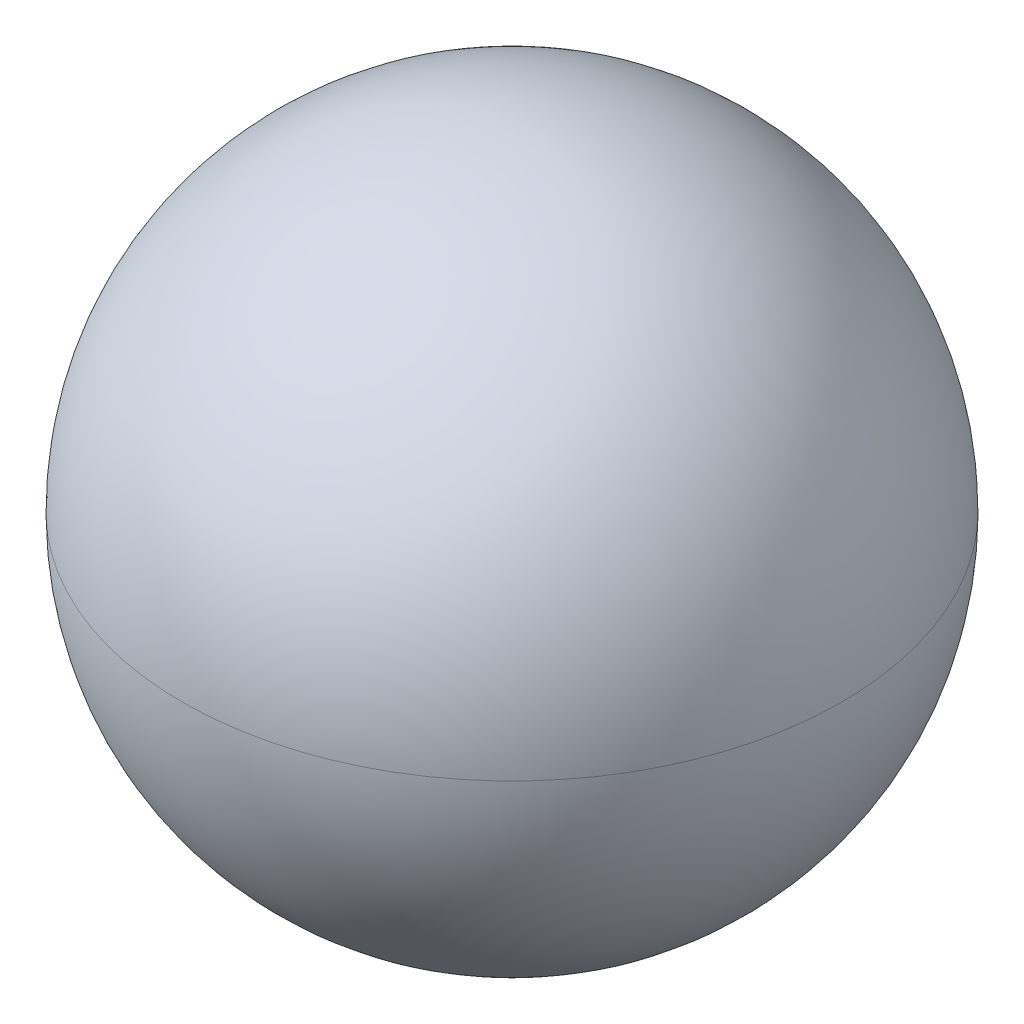
ISO-10303-21;
HEADER;
FILE_DESCRIPTION(('STEP AP214'),'2;1');
FILE_NAME('part.step','',(''),(''),'','','');
FILE_SCHEMA(('AUTOMOTIVE_DESIGN { 1 0 10303 214 1 1 1 1 }'));
ENDSEC;
DATA;
#1=APPLICATION_CONTEXT('core data for automotive mechanical design processes');
#2=APPLICATION_PROTOCOL_DEFINITION('international standard','automotive_design',2000,#1);
#3=PRODUCT_CONTEXT('',#1,'mechanical');
#4=PRODUCT('Part','Part','',(#3));
#5=PRODUCT_RELATED_PRODUCT_CATEGORY('part','',(#4));
#6=PRODUCT_DEFINITION_FORMATION('','',#4);
#7=PRODUCT_DEFINITION_CONTEXT('part definition',#1,'design');
#8=PRODUCT_DEFINITION('design','',#6,#7);
#9=PRODUCT_DEFINITION_SHAPE('','',#8);
#10=(LENGTH_UNIT() NAMED_UNIT(*) SI_UNIT(.MILLI.,.METRE.));
#11=(NAMED_UNIT(*) PLANE_ANGLE_UNIT() SI_UNIT($,.RADIAN.));
#12=(NAMED_UNIT(*) SI_UNIT($,.STERADIAN.) SOLID_ANGLE_UNIT());
#13=UNCERTAINTY_MEASURE_WITH_UNIT(LENGTH_MEASURE(1.E-05),#10,'distance_accuracy_value','');
#14=(GEOMETRIC_REPRESENTATION_CONTEXT(3) GLOBAL_UNCERTAINTY_ASSIGNED_CONTEXT((#13)) GLOBAL_UNIT_ASSIGNED_CONTEXT((#10,
#11,#12)) REPRESENTATION_CONTEXT('',''));
#15=CARTESIAN_POINT('',(0.,0.,0.));
#16=DIRECTION('',(0.,0.,1.));
#17=DIRECTION('',(1.,0.,0.));
#18=AXIS2_PLACEMENT_3D('',#15,#16,#17);
#19=CARTESIAN_POINT('',(0.,0.,0.));
#20=DIRECTION('',(0.,-1.,0.));
#21=DIRECTION('',(-1.,0.,0.));
#22=AXIS2_PLACEMENT_3D('',#19,#20,#21);
#23=SPHERICAL_SURFACE('',#22,1.);
#24=CARTESIAN_POINT('',(0.,-0.866025403784438,0.));
#25=DIRECTION('',(0.,-1.,0.));
#26=DIRECTION('',(0.,0.,-1.));
#27=AXIS2_PLACEMENT_3D('',#24,#25,#26);
#28=CIRCLE('',#27,0.5);
#29=CARTESIAN_POINT('',(0.,-0.866025403784438,-0.5));
#30=VERTEX_POINT('',#29);
#31=EDGE_CURVE('E53',#30,#30,#28,.T.);
#32=ORIENTED_EDGE('',*,*,#31,.T.);
#33=EDGE_LOOP('',(#32));
#34=FACE_BOUND('',#33,.T.);
#35=CARTESIAN_POINT('',(0.,0.,0.));
#36=DIRECTION('',(0.,1.,0.));
#37=DIRECTION('',(0.,0.,1.));
#38=AXIS2_PLACEMENT_3D('',#35,#36,#37);
#39=CIRCLE('',#38,1.);
#40=CARTESIAN_POINT('',(0.,0.,1.));
#41=VERTEX_POINT('',#40);
#42=EDGE_CURVE('E10',#41,#41,#39,.T.);
#43=ORIENTED_EDGE('',*,*,#42,.T.);
#44=EDGE_LOOP('',(#43));
#45=FACE_BOUND('',#44,.T.);
#46=ADVANCED_FACE('F32',(#34,#45),#23,.F.);
#47=CARTESIAN_POINT('',(0.,-1.18301270189222,0.));
#48=DIRECTION('',(0.,-1.,0.));
#49=DIRECTION('',(0.,0.,-1.));
#50=AXIS2_PLACEMENT_3D('',#47,#48,#49);
#51=TOROIDAL_SURFACE('',#50,0.911437827766148,0.519386208209842);
#52=CARTESIAN_POINT('',(0.,-1.6616889514941,0.));
#53=DIRECTION('',(0.,-1.,0.));
#54=DIRECTION('',(0.,0.,-1.));
#55=AXIS2_PLACEMENT_3D('',#52,#53,#54);
#56=CIRCLE('',#55,1.11300935687102);
#57=CARTESIAN_POINT('',(0.,-1.6616889514941,-1.11300935687102));
#58=VERTEX_POINT('',#57);
#59=EDGE_CURVE('E48',#58,#58,#56,.T.);
#60=ORIENTED_EDGE('',*,*,#59,.T.);
#61=EDGE_LOOP('',(#60));
#62=FACE_BOUND('',#61,.T.);
#63=CARTESIAN_POINT('',(0.,-1.18301270189222,0.));
#64=DIRECTION('',(0.,1.,0.));
#65=DIRECTION('',(0.,0.,1.));
#66=AXIS2_PLACEMENT_3D('',#63,#64,#65);
#67=CIRCLE('',#66,0.392051619556306);
#68=CARTESIAN_POINT('',(0.,-1.18301270189222,0.392051619556306));
#69=VERTEX_POINT('',#68);
#70=EDGE_CURVE('E39',#69,#69,#67,.T.);
#71=ORIENTED_EDGE('',*,*,#70,.T.);
#72=EDGE_LOOP('',(#71));
#73=FACE_BOUND('',#72,.T.);
#74=ADVANCED_FACE('F62',(#62,#73),#51,.T.);
#75=CARTESIAN_POINT('',(0.,0.,0.));
#76=DIRECTION('',(0.,-1.,0.));
#77=DIRECTION('',(-1.,0.,0.));
#78=AXIS2_PLACEMENT_3D('',#75,#76,#77);
#79=SPHERICAL_SURFACE('',#78,2.);
#80=ORIENTED_EDGE('',*,*,#59,.F.);
#81=EDGE_LOOP('',(#80));
#82=FACE_BOUND('',#81,.T.);
#83=CARTESIAN_POINT('',(0.,0.,0.));
#84=DIRECTION('',(0.,-1.,0.));
#85=DIRECTION('',(0.,0.,-1.));
#86=AXIS2_PLACEMENT_3D('',#83,#84,#85);
#87=CIRCLE('',#86,2.);
#88=CARTESIAN_POINT('',(0.,0.,-2.));
#89=VERTEX_POINT('',#88);
#90=EDGE_CURVE('E43',#89,#89,#87,.T.);
#91=ORIENTED_EDGE('',*,*,#90,.T.);
#92=EDGE_LOOP('',(#91));
#93=FACE_BOUND('',#92,.T.);
#94=ADVANCED_FACE('F69',(#82,#93),#79,.T.);
#95=ORIENTED_EDGE('',*,*,#90,.F.);
#96=EDGE_LOOP('',(#95));
#97=FACE_BOUND('',#96,.T.);
#98=ADVANCED_FACE('F34',(#97),#79,.T.);
#99=ORIENTED_EDGE('',*,*,#70,.F.);
#100=EDGE_LOOP('',(#99));
#101=FACE_BOUND('',#100,.T.);
#102=ORIENTED_EDGE('',*,*,#31,.F.);
#103=EDGE_LOOP('',(#102));
#104=FACE_BOUND('',#103,.T.);
#105=ADVANCED_FACE('F58',(#101,#104),#51,.T.);
#106=ORIENTED_EDGE('',*,*,#42,.F.);
#107=EDGE_LOOP('',(#106));
#108=FACE_BOUND('',#107,.T.);
#109=ADVANCED_FACE('F60',(#108),#23,.F.);
#110=CLOSED_SHELL('',(#46,#74,#94,#98,#105,#109));
#111=MANIFOLD_SOLID_BREP('B2',#110);
#112=ADVANCED_BREP_SHAPE_REPRESENTATION('',(#18,#111),#14);
#113=SHAPE_DEFINITION_REPRESENTATION(#9,#112);
ENDSEC;
END-ISO-10303-21;
